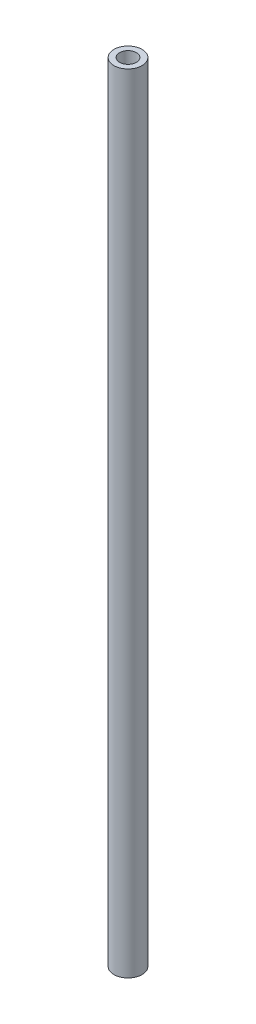
ISO-10303-21;
HEADER;
FILE_DESCRIPTION(('STEP AP214'),'2;1');
FILE_NAME('part.step','',(''),(''),'','','');
FILE_SCHEMA(('AUTOMOTIVE_DESIGN { 1 0 10303 214 1 1 1 1 }'));
ENDSEC;
DATA;
#1=APPLICATION_CONTEXT('core data for automotive mechanical design processes');
#2=APPLICATION_PROTOCOL_DEFINITION('international standard','automotive_design',2000,#1);
#3=PRODUCT_CONTEXT('',#1,'mechanical');
#4=PRODUCT('Part','Part','',(#3));
#5=PRODUCT_RELATED_PRODUCT_CATEGORY('part','',(#4));
#6=PRODUCT_DEFINITION_FORMATION('','',#4);
#7=PRODUCT_DEFINITION_CONTEXT('part definition',#1,'design');
#8=PRODUCT_DEFINITION('design','',#6,#7);
#9=PRODUCT_DEFINITION_SHAPE('','',#8);
#10=(LENGTH_UNIT() NAMED_UNIT(*) SI_UNIT(.MILLI.,.METRE.));
#11=(NAMED_UNIT(*) PLANE_ANGLE_UNIT() SI_UNIT($,.RADIAN.));
#12=(NAMED_UNIT(*) SI_UNIT($,.STERADIAN.) SOLID_ANGLE_UNIT());
#13=UNCERTAINTY_MEASURE_WITH_UNIT(LENGTH_MEASURE(1.E-05),#10,'distance_accuracy_value','');
#14=(GEOMETRIC_REPRESENTATION_CONTEXT(3) GLOBAL_UNCERTAINTY_ASSIGNED_CONTEXT((#13)) GLOBAL_UNIT_ASSIGNED_CONTEXT((#10,
#11,#12)) REPRESENTATION_CONTEXT('',''));
#15=CARTESIAN_POINT('',(0.,0.,0.));
#16=DIRECTION('',(0.,0.,1.));
#17=DIRECTION('',(1.,0.,0.));
#18=AXIS2_PLACEMENT_3D('',#15,#16,#17);
#19=CARTESIAN_POINT('',(0.,70.,0.));
#20=DIRECTION('',(0.,1.,0.));
#21=DIRECTION('',(0.,0.,1.));
#22=AXIS2_PLACEMENT_3D('',#19,#20,#21);
#23=PLANE('',#22);
#24=CARTESIAN_POINT('',(0.,70.,0.));
#25=DIRECTION('',(0.,1.,0.));
#26=DIRECTION('',(0.,0.,1.));
#27=AXIS2_PLACEMENT_3D('',#24,#25,#26);
#28=CIRCLE('',#27,2.5);
#29=CARTESIAN_POINT('',(0.,70.,2.5));
#30=VERTEX_POINT('',#29);
#31=EDGE_CURVE('E10',#30,#30,#28,.T.);
#32=ORIENTED_EDGE('',*,*,#31,.T.);
#33=EDGE_LOOP('',(#32));
#34=FACE_BOUND('',#33,.T.);
#35=CARTESIAN_POINT('',(0.,70.,0.));
#36=DIRECTION('',(0.,1.,0.));
#37=DIRECTION('',(0.,0.,1.));
#38=AXIS2_PLACEMENT_3D('',#35,#36,#37);
#39=CIRCLE('',#38,1.5);
#40=CARTESIAN_POINT('',(0.,70.,1.5));
#41=VERTEX_POINT('',#40);
#42=EDGE_CURVE('E44',#41,#41,#39,.T.);
#43=ORIENTED_EDGE('',*,*,#42,.F.);
#44=EDGE_LOOP('',(#43));
#45=FACE_BOUND('',#44,.T.);
#46=ADVANCED_FACE('F33',(#34,#45),#23,.T.);
#47=CARTESIAN_POINT('',(0.,-70.,0.));
#48=DIRECTION('',(0.,1.,0.));
#49=DIRECTION('',(0.,0.,1.));
#50=AXIS2_PLACEMENT_3D('',#47,#48,#49);
#51=PLANE('',#50);
#52=CARTESIAN_POINT('',(0.,-70.,0.));
#53=DIRECTION('',(0.,1.,0.));
#54=DIRECTION('',(0.,0.,1.));
#55=AXIS2_PLACEMENT_3D('',#52,#53,#54);
#56=CIRCLE('',#55,2.5);
#57=CARTESIAN_POINT('',(0.,-70.,2.5));
#58=VERTEX_POINT('',#57);
#59=EDGE_CURVE('E37',#58,#58,#56,.T.);
#60=ORIENTED_EDGE('',*,*,#59,.F.);
#61=EDGE_LOOP('',(#60));
#62=FACE_BOUND('',#61,.T.);
#63=CARTESIAN_POINT('',(0.,-70.,0.));
#64=DIRECTION('',(0.,1.,0.));
#65=DIRECTION('',(0.,0.,1.));
#66=AXIS2_PLACEMENT_3D('',#63,#64,#65);
#67=CIRCLE('',#66,1.5);
#68=CARTESIAN_POINT('',(0.,-70.,1.5));
#69=VERTEX_POINT('',#68);
#70=EDGE_CURVE('E46',#69,#69,#67,.T.);
#71=ORIENTED_EDGE('',*,*,#70,.T.);
#72=EDGE_LOOP('',(#71));
#73=FACE_BOUND('',#72,.T.);
#74=ADVANCED_FACE('F56',(#62,#73),#51,.F.);
#75=CARTESIAN_POINT('',(0.,70.,0.));
#76=DIRECTION('',(0.,-1.,0.));
#77=DIRECTION('',(0.,0.,-1.));
#78=AXIS2_PLACEMENT_3D('',#75,#76,#77);
#79=CYLINDRICAL_SURFACE('',#78,2.5);
#80=ORIENTED_EDGE('',*,*,#31,.F.);
#81=EDGE_LOOP('',(#80));
#82=FACE_BOUND('',#81,.T.);
#83=ORIENTED_EDGE('',*,*,#59,.T.);
#84=EDGE_LOOP('',(#83));
#85=FACE_BOUND('',#84,.T.);
#86=ADVANCED_FACE('F35',(#82,#85),#79,.T.);
#87=CARTESIAN_POINT('',(0.,70.,0.));
#88=DIRECTION('',(0.,-1.,0.));
#89=DIRECTION('',(0.,0.,-1.));
#90=AXIS2_PLACEMENT_3D('',#87,#88,#89);
#91=CYLINDRICAL_SURFACE('',#90,1.5);
#92=ORIENTED_EDGE('',*,*,#42,.T.);
#93=EDGE_LOOP('',(#92));
#94=FACE_BOUND('',#93,.T.);
#95=ORIENTED_EDGE('',*,*,#70,.F.);
#96=EDGE_LOOP('',(#95));
#97=FACE_BOUND('',#96,.T.);
#98=ADVANCED_FACE('F52',(#94,#97),#91,.F.);
#99=CLOSED_SHELL('',(#46,#74,#86,#98));
#100=MANIFOLD_SOLID_BREP('B2',#99);
#101=ADVANCED_BREP_SHAPE_REPRESENTATION('',(#18,#100),#14);
#102=SHAPE_DEFINITION_REPRESENTATION(#9,#101);
ENDSEC;
END-ISO-10303-21;
